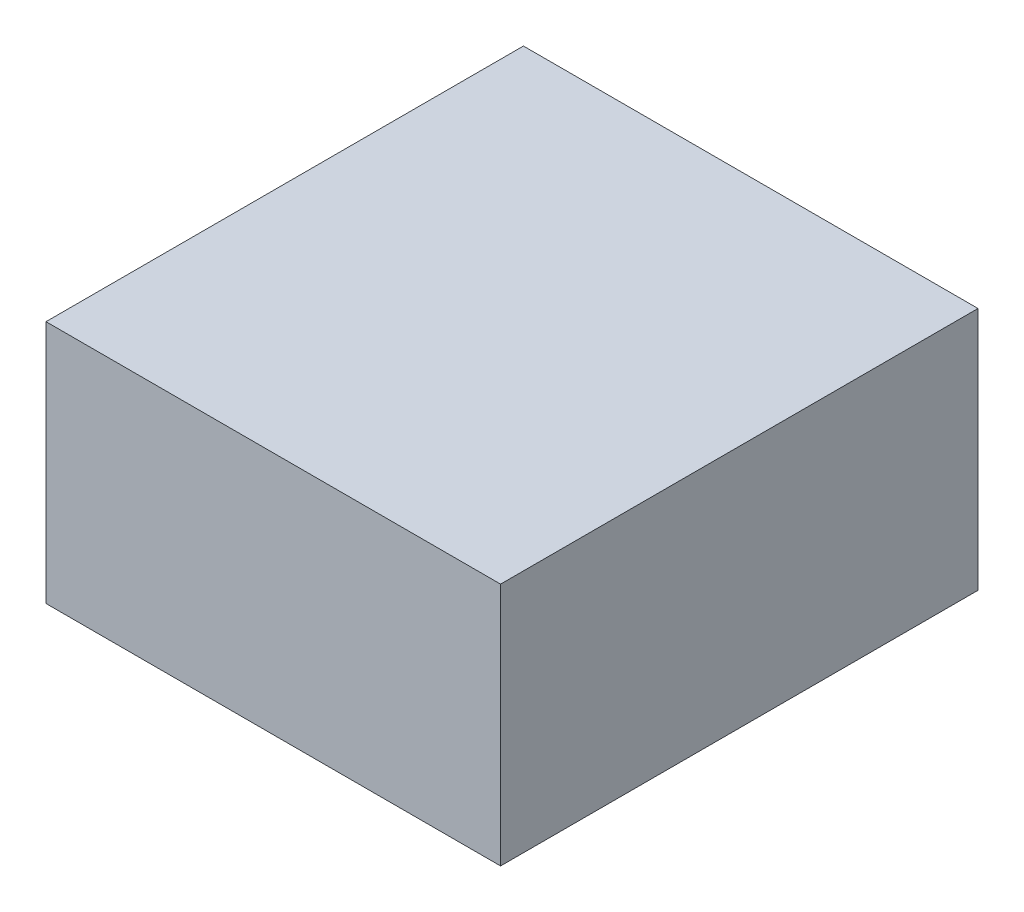
ISO-10303-21;
HEADER;
FILE_DESCRIPTION(('STEP AP214'),'2;1');
FILE_NAME('part.step','',(''),(''),'','','');
FILE_SCHEMA(('AUTOMOTIVE_DESIGN { 1 0 10303 214 1 1 1 1 }'));
ENDSEC;
DATA;
#1=APPLICATION_CONTEXT('core data for automotive mechanical design processes');
#2=APPLICATION_PROTOCOL_DEFINITION('international standard','automotive_design',2000,#1);
#3=PRODUCT_CONTEXT('',#1,'mechanical');
#4=PRODUCT('Part','Part','',(#3));
#5=PRODUCT_RELATED_PRODUCT_CATEGORY('part','',(#4));
#6=PRODUCT_DEFINITION_FORMATION('','',#4);
#7=PRODUCT_DEFINITION_CONTEXT('part definition',#1,'design');
#8=PRODUCT_DEFINITION('design','',#6,#7);
#9=PRODUCT_DEFINITION_SHAPE('','',#8);
#10=(LENGTH_UNIT() NAMED_UNIT(*) SI_UNIT(.MILLI.,.METRE.));
#11=(NAMED_UNIT(*) PLANE_ANGLE_UNIT() SI_UNIT($,.RADIAN.));
#12=(NAMED_UNIT(*) SI_UNIT($,.STERADIAN.) SOLID_ANGLE_UNIT());
#13=UNCERTAINTY_MEASURE_WITH_UNIT(LENGTH_MEASURE(1.E-05),#10,'distance_accuracy_value','');
#14=(GEOMETRIC_REPRESENTATION_CONTEXT(3) GLOBAL_UNCERTAINTY_ASSIGNED_CONTEXT((#13)) GLOBAL_UNIT_ASSIGNED_CONTEXT((#10,
#11,#12)) REPRESENTATION_CONTEXT('',''));
#15=CARTESIAN_POINT('',(0.,0.,0.));
#16=DIRECTION('',(0.,0.,1.));
#17=DIRECTION('',(1.,0.,0.));
#18=AXIS2_PLACEMENT_3D('',#15,#16,#17);
#19=CARTESIAN_POINT('',(0.,50.,0.));
#20=DIRECTION('',(0.,1.,0.));
#21=DIRECTION('',(0.,0.,1.));
#22=AXIS2_PLACEMENT_3D('',#19,#20,#21);
#23=PLANE('',#22);
#24=DIRECTION('',(1.,0.,0.));
#25=VECTOR('',#24,1.);
#26=CARTESIAN_POINT('',(-46.5564829141396,50.,-48.8973116640126));
#27=LINE('',#26,#25);
#28=CARTESIAN_POINT('',(-46.5564829141396,50.,-48.8973116640126));
#29=VERTEX_POINT('',#28);
#30=CARTESIAN_POINT('',(46.5564829141396,50.,-48.8973116640126));
#31=VERTEX_POINT('',#30);
#32=EDGE_CURVE('E122',#29,#31,#27,.T.);
#33=ORIENTED_EDGE('',*,*,#32,.F.);
#34=DIRECTION('',(0.,0.,-1.));
#35=VECTOR('',#34,1.);
#36=CARTESIAN_POINT('',(-46.5564829141396,50.,48.8973116640126));
#37=LINE('',#36,#35);
#38=CARTESIAN_POINT('',(-46.5564829141396,50.,48.8973116640126));
#39=VERTEX_POINT('',#38);
#40=EDGE_CURVE('E109',#39,#29,#37,.T.);
#41=ORIENTED_EDGE('',*,*,#40,.F.);
#42=DIRECTION('',(1.,0.,0.));
#43=VECTOR('',#42,1.);
#44=CARTESIAN_POINT('',(-46.5564829141396,50.,48.8973116640126));
#45=LINE('',#44,#43);
#46=CARTESIAN_POINT('',(46.5564829141396,50.,48.8973116640126));
#47=VERTEX_POINT('',#46);
#48=EDGE_CURVE('E107',#39,#47,#45,.T.);
#49=ORIENTED_EDGE('',*,*,#48,.T.);
#50=DIRECTION('',(0.,0.,-1.));
#51=VECTOR('',#50,1.);
#52=CARTESIAN_POINT('',(46.5564829141396,50.,48.8973116640126));
#53=LINE('',#52,#51);
#54=EDGE_CURVE('E104',#47,#31,#53,.T.);
#55=ORIENTED_EDGE('',*,*,#54,.T.);
#56=EDGE_LOOP('',(#33,#41,#49,#55));
#57=FACE_BOUND('',#56,.T.);
#58=ADVANCED_FACE('F60',(#57),#23,.T.);
#59=CARTESIAN_POINT('',(-46.5564829141396,50.,-48.8973116640126));
#60=DIRECTION('',(0.,0.,-1.));
#61=DIRECTION('',(-1.,0.,0.));
#62=AXIS2_PLACEMENT_3D('',#59,#60,#61);
#63=PLANE('',#62);
#64=DIRECTION('',(1.,0.,0.));
#65=VECTOR('',#64,1.);
#66=CARTESIAN_POINT('',(-46.5564829141396,0.,-48.8973116640126));
#67=LINE('',#66,#65);
#68=CARTESIAN_POINT('',(-46.5564829141396,0.,-48.8973116640126));
#69=VERTEX_POINT('',#68);
#70=CARTESIAN_POINT('',(46.5564829141396,0.,-48.8973116640126));
#71=VERTEX_POINT('',#70);
#72=EDGE_CURVE('E130',#69,#71,#67,.T.);
#73=ORIENTED_EDGE('',*,*,#72,.F.);
#74=DIRECTION('',(0.,-1.,0.));
#75=VECTOR('',#74,1.);
#76=CARTESIAN_POINT('',(-46.5564829141396,50.,-48.8973116640126));
#77=LINE('',#76,#75);
#78=EDGE_CURVE('E12',#29,#69,#77,.T.);
#79=ORIENTED_EDGE('',*,*,#78,.F.);
#80=ORIENTED_EDGE('',*,*,#32,.T.);
#81=DIRECTION('',(0.,-1.,0.));
#82=VECTOR('',#81,1.);
#83=CARTESIAN_POINT('',(46.5564829141396,50.,-48.8973116640126));
#84=LINE('',#83,#82);
#85=EDGE_CURVE('E64',#31,#71,#84,.T.);
#86=ORIENTED_EDGE('',*,*,#85,.T.);
#87=EDGE_LOOP('',(#73,#79,#80,#86));
#88=FACE_BOUND('',#87,.T.);
#89=ADVANCED_FACE('F144',(#88),#63,.T.);
#90=CARTESIAN_POINT('',(-46.5564829141396,50.,48.8973116640126));
#91=DIRECTION('',(-1.,0.,0.));
#92=DIRECTION('',(0.,0.,1.));
#93=AXIS2_PLACEMENT_3D('',#90,#91,#92);
#94=PLANE('',#93);
#95=DIRECTION('',(0.,0.,-1.));
#96=VECTOR('',#95,1.);
#97=CARTESIAN_POINT('',(-46.5564829141396,0.,48.8973116640126));
#98=LINE('',#97,#96);
#99=CARTESIAN_POINT('',(-46.5564829141396,0.,48.8973116640126));
#100=VERTEX_POINT('',#99);
#101=EDGE_CURVE('E125',#100,#69,#98,.T.);
#102=ORIENTED_EDGE('',*,*,#101,.F.);
#103=DIRECTION('',(0.,-1.,0.));
#104=VECTOR('',#103,1.);
#105=CARTESIAN_POINT('',(-46.5564829141396,50.,48.8973116640126));
#106=LINE('',#105,#104);
#107=EDGE_CURVE('E71',#39,#100,#106,.T.);
#108=ORIENTED_EDGE('',*,*,#107,.F.);
#109=ORIENTED_EDGE('',*,*,#40,.T.);
#110=ORIENTED_EDGE('',*,*,#78,.T.);
#111=EDGE_LOOP('',(#102,#108,#109,#110));
#112=FACE_BOUND('',#111,.T.);
#113=ADVANCED_FACE('F146',(#112),#94,.T.);
#114=CARTESIAN_POINT('',(-46.5564829141396,50.,48.8973116640126));
#115=DIRECTION('',(0.,0.,-1.));
#116=DIRECTION('',(-1.,0.,0.));
#117=AXIS2_PLACEMENT_3D('',#114,#115,#116);
#118=PLANE('',#117);
#119=DIRECTION('',(1.,0.,0.));
#120=VECTOR('',#119,1.);
#121=CARTESIAN_POINT('',(-46.5564829141396,0.,48.8973116640126));
#122=LINE('',#121,#120);
#123=CARTESIAN_POINT('',(46.5564829141396,0.,48.8973116640126));
#124=VERTEX_POINT('',#123);
#125=EDGE_CURVE('E115',#100,#124,#122,.T.);
#126=ORIENTED_EDGE('',*,*,#125,.T.);
#127=DIRECTION('',(0.,-1.,0.));
#128=VECTOR('',#127,1.);
#129=CARTESIAN_POINT('',(46.5564829141396,50.,48.8973116640126));
#130=LINE('',#129,#128);
#131=EDGE_CURVE('E113',#47,#124,#130,.T.);
#132=ORIENTED_EDGE('',*,*,#131,.F.);
#133=ORIENTED_EDGE('',*,*,#48,.F.);
#134=ORIENTED_EDGE('',*,*,#107,.T.);
#135=EDGE_LOOP('',(#126,#132,#133,#134));
#136=FACE_BOUND('',#135,.T.);
#137=ADVANCED_FACE('F114',(#136),#118,.F.);
#138=CARTESIAN_POINT('',(46.5564829141396,50.,48.8973116640126));
#139=DIRECTION('',(-1.,0.,0.));
#140=DIRECTION('',(0.,0.,1.));
#141=AXIS2_PLACEMENT_3D('',#138,#139,#140);
#142=PLANE('',#141);
#143=DIRECTION('',(0.,0.,-1.));
#144=VECTOR('',#143,1.);
#145=CARTESIAN_POINT('',(46.5564829141396,0.,48.8973116640126));
#146=LINE('',#145,#144);
#147=EDGE_CURVE('E134',#124,#71,#146,.T.);
#148=ORIENTED_EDGE('',*,*,#147,.T.);
#149=ORIENTED_EDGE('',*,*,#85,.F.);
#150=ORIENTED_EDGE('',*,*,#54,.F.);
#151=ORIENTED_EDGE('',*,*,#131,.T.);
#152=EDGE_LOOP('',(#148,#149,#150,#151));
#153=FACE_BOUND('',#152,.T.);
#154=ADVANCED_FACE('F120',(#153),#142,.F.);
#155=CARTESIAN_POINT('',(0.,0.,0.));
#156=DIRECTION('',(0.,1.,0.));
#157=DIRECTION('',(0.,0.,1.));
#158=AXIS2_PLACEMENT_3D('',#155,#156,#157);
#159=PLANE('',#158);
#160=ORIENTED_EDGE('',*,*,#72,.T.);
#161=ORIENTED_EDGE('',*,*,#147,.F.);
#162=ORIENTED_EDGE('',*,*,#125,.F.);
#163=ORIENTED_EDGE('',*,*,#101,.T.);
#164=EDGE_LOOP('',(#160,#161,#162,#163));
#165=FACE_BOUND('',#164,.T.);
#166=ADVANCED_FACE('F62',(#165),#159,.F.);
#167=CLOSED_SHELL('',(#58,#89,#113,#137,#154,#166));
#168=MANIFOLD_SOLID_BREP('B2',#167);
#169=ADVANCED_BREP_SHAPE_REPRESENTATION('',(#18,#168),#14);
#170=SHAPE_DEFINITION_REPRESENTATION(#9,#169);
ENDSEC;
END-ISO-10303-21;
